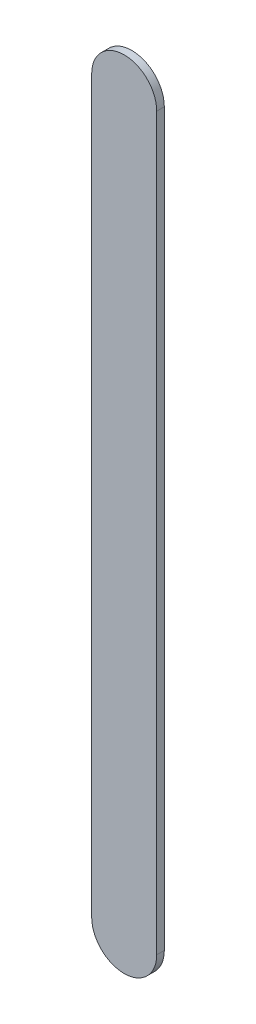
ISO-10303-21;
HEADER;
FILE_DESCRIPTION(('STEP AP214'),'2;1');
FILE_NAME('part.step','',(''),(''),'','','');
FILE_SCHEMA(('AUTOMOTIVE_DESIGN { 1 0 10303 214 1 1 1 1 }'));
ENDSEC;
DATA;
#1=APPLICATION_CONTEXT('core data for automotive mechanical design processes');
#2=APPLICATION_PROTOCOL_DEFINITION('international standard','automotive_design',2000,#1);
#3=PRODUCT_CONTEXT('',#1,'mechanical');
#4=PRODUCT('Part','Part','',(#3));
#5=PRODUCT_RELATED_PRODUCT_CATEGORY('part','',(#4));
#6=PRODUCT_DEFINITION_FORMATION('','',#4);
#7=PRODUCT_DEFINITION_CONTEXT('part definition',#1,'design');
#8=PRODUCT_DEFINITION('design','',#6,#7);
#9=PRODUCT_DEFINITION_SHAPE('','',#8);
#10=(LENGTH_UNIT() NAMED_UNIT(*) SI_UNIT(.MILLI.,.METRE.));
#11=(NAMED_UNIT(*) PLANE_ANGLE_UNIT() SI_UNIT($,.RADIAN.));
#12=(NAMED_UNIT(*) SI_UNIT($,.STERADIAN.) SOLID_ANGLE_UNIT());
#13=UNCERTAINTY_MEASURE_WITH_UNIT(LENGTH_MEASURE(1.E-05),#10,'distance_accuracy_value','');
#14=(GEOMETRIC_REPRESENTATION_CONTEXT(3) GLOBAL_UNCERTAINTY_ASSIGNED_CONTEXT((#13)) GLOBAL_UNIT_ASSIGNED_CONTEXT((#10,
#11,#12)) REPRESENTATION_CONTEXT('',''));
#15=CARTESIAN_POINT('',(0.,0.,0.));
#16=DIRECTION('',(0.,0.,1.));
#17=DIRECTION('',(1.,0.,0.));
#18=AXIS2_PLACEMENT_3D('',#15,#16,#17);
#19=CARTESIAN_POINT('',(126.36,-72.22,1.635));
#20=DIRECTION('',(0.,0.,1.));
#21=DIRECTION('',(1.,0.,0.));
#22=AXIS2_PLACEMENT_3D('',#19,#20,#21);
#23=PLANE('',#22);
#24=DIRECTION('',(0.,-1.,0.));
#25=VECTOR('',#24,1.);
#26=CARTESIAN_POINT('',(126.36,-72.22,1.635));
#27=LINE('',#26,#25);
#28=CARTESIAN_POINT('',(126.36,-72.22,1.635));
#29=VERTEX_POINT('',#28);
#30=CARTESIAN_POINT('',(126.36,-75.59,1.635));
#31=VERTEX_POINT('',#30);
#32=EDGE_CURVE('E82',#29,#31,#27,.T.);
#33=ORIENTED_EDGE('',*,*,#32,.T.);
#34=CARTESIAN_POINT('',(126.51,-75.59,1.635));
#35=DIRECTION('',(0.,0.,1.));
#36=DIRECTION('',(-1.,0.,0.));
#37=AXIS2_PLACEMENT_3D('',#34,#35,#36);
#38=CIRCLE('',#37,0.15);
#39=CARTESIAN_POINT('',(126.66,-75.59,1.635));
#40=VERTEX_POINT('',#39);
#41=EDGE_CURVE('E107',#31,#40,#38,.T.);
#42=ORIENTED_EDGE('',*,*,#41,.T.);
#43=DIRECTION('',(0.,1.,0.));
#44=VECTOR('',#43,1.);
#45=CARTESIAN_POINT('',(126.66,-75.59,1.635));
#46=LINE('',#45,#44);
#47=CARTESIAN_POINT('',(126.66,-72.22,1.635));
#48=VERTEX_POINT('',#47);
#49=EDGE_CURVE('E75',#40,#48,#46,.T.);
#50=ORIENTED_EDGE('',*,*,#49,.T.);
#51=CARTESIAN_POINT('',(126.51,-72.22,1.635));
#52=DIRECTION('',(0.,0.,1.));
#53=DIRECTION('',(1.,0.,0.));
#54=AXIS2_PLACEMENT_3D('',#51,#52,#53);
#55=CIRCLE('',#54,0.15);
#56=EDGE_CURVE('E11',#48,#29,#55,.T.);
#57=ORIENTED_EDGE('',*,*,#56,.T.);
#58=EDGE_LOOP('',(#33,#42,#50,#57));
#59=FACE_BOUND('',#58,.T.);
#60=ADVANCED_FACE('F17',(#59),#23,.T.);
#61=CARTESIAN_POINT('',(126.36,-72.22,1.6));
#62=DIRECTION('',(0.,0.,1.));
#63=DIRECTION('',(1.,0.,0.));
#64=AXIS2_PLACEMENT_3D('',#61,#62,#63);
#65=PLANE('',#64);
#66=CARTESIAN_POINT('',(126.51,-72.22,1.6));
#67=DIRECTION('',(0.,0.,1.));
#68=DIRECTION('',(1.,0.,0.));
#69=AXIS2_PLACEMENT_3D('',#66,#67,#68);
#70=CIRCLE('',#69,0.15);
#71=CARTESIAN_POINT('',(126.66,-72.22,1.6));
#72=VERTEX_POINT('',#71);
#73=CARTESIAN_POINT('',(126.36,-72.22,1.6));
#74=VERTEX_POINT('',#73);
#75=EDGE_CURVE('E21',#72,#74,#70,.T.);
#76=ORIENTED_EDGE('',*,*,#75,.F.);
#77=DIRECTION('',(0.,1.,0.));
#78=VECTOR('',#77,1.);
#79=CARTESIAN_POINT('',(126.66,-75.59,1.6));
#80=LINE('',#79,#78);
#81=CARTESIAN_POINT('',(126.66,-75.59,1.6));
#82=VERTEX_POINT('',#81);
#83=EDGE_CURVE('E98',#82,#72,#80,.T.);
#84=ORIENTED_EDGE('',*,*,#83,.F.);
#85=CARTESIAN_POINT('',(126.51,-75.59,1.6));
#86=DIRECTION('',(0.,0.,1.));
#87=DIRECTION('',(-1.,0.,0.));
#88=AXIS2_PLACEMENT_3D('',#85,#86,#87);
#89=CIRCLE('',#88,0.15);
#90=CARTESIAN_POINT('',(126.36,-75.59,1.6));
#91=VERTEX_POINT('',#90);
#92=EDGE_CURVE('E84',#91,#82,#89,.T.);
#93=ORIENTED_EDGE('',*,*,#92,.F.);
#94=DIRECTION('',(0.,-1.,0.));
#95=VECTOR('',#94,1.);
#96=CARTESIAN_POINT('',(126.36,-72.22,1.6));
#97=LINE('',#96,#95);
#98=EDGE_CURVE('E80',#74,#91,#97,.T.);
#99=ORIENTED_EDGE('',*,*,#98,.F.);
#100=EDGE_LOOP('',(#76,#84,#93,#99));
#101=FACE_BOUND('',#100,.T.);
#102=ADVANCED_FACE('F86',(#101),#65,.F.);
#103=CARTESIAN_POINT('',(126.51,-72.22,1.6));
#104=DIRECTION('',(0.,0.,-1.));
#105=DIRECTION('',(1.,0.,0.));
#106=AXIS2_PLACEMENT_3D('',#103,#104,#105);
#107=CYLINDRICAL_SURFACE('',#106,0.15);
#108=ORIENTED_EDGE('',*,*,#75,.T.);
#109=DIRECTION('',(0.,0.,1.));
#110=VECTOR('',#109,1.);
#111=CARTESIAN_POINT('',(126.36,-72.22,1.6));
#112=LINE('',#111,#110);
#113=EDGE_CURVE('E69',#74,#29,#112,.T.);
#114=ORIENTED_EDGE('',*,*,#113,.T.);
#115=ORIENTED_EDGE('',*,*,#56,.F.);
#116=DIRECTION('',(0.,0.,1.));
#117=VECTOR('',#116,1.);
#118=CARTESIAN_POINT('',(126.66,-72.22,1.6));
#119=LINE('',#118,#117);
#120=EDGE_CURVE('E72',#72,#48,#119,.T.);
#121=ORIENTED_EDGE('',*,*,#120,.F.);
#122=EDGE_LOOP('',(#108,#114,#115,#121));
#123=FACE_BOUND('',#122,.T.);
#124=ADVANCED_FACE('F19',(#123),#107,.T.);
#125=CARTESIAN_POINT('',(126.66,-75.59,1.6));
#126=DIRECTION('',(-1.,0.,0.));
#127=DIRECTION('',(0.,0.,1.));
#128=AXIS2_PLACEMENT_3D('',#125,#126,#127);
#129=PLANE('',#128);
#130=ORIENTED_EDGE('',*,*,#83,.T.);
#131=ORIENTED_EDGE('',*,*,#120,.T.);
#132=ORIENTED_EDGE('',*,*,#49,.F.);
#133=DIRECTION('',(0.,0.,1.));
#134=VECTOR('',#133,1.);
#135=CARTESIAN_POINT('',(126.66,-75.59,1.6));
#136=LINE('',#135,#134);
#137=EDGE_CURVE('E104',#82,#40,#136,.T.);
#138=ORIENTED_EDGE('',*,*,#137,.F.);
#139=EDGE_LOOP('',(#130,#131,#132,#138));
#140=FACE_BOUND('',#139,.T.);
#141=ADVANCED_FACE('F121',(#140),#129,.F.);
#142=CARTESIAN_POINT('',(126.51,-75.59,1.6));
#143=DIRECTION('',(0.,0.,-1.));
#144=DIRECTION('',(-1.,0.,0.));
#145=AXIS2_PLACEMENT_3D('',#142,#143,#144);
#146=CYLINDRICAL_SURFACE('',#145,0.15);
#147=ORIENTED_EDGE('',*,*,#92,.T.);
#148=ORIENTED_EDGE('',*,*,#137,.T.);
#149=ORIENTED_EDGE('',*,*,#41,.F.);
#150=DIRECTION('',(0.,0.,1.));
#151=VECTOR('',#150,1.);
#152=CARTESIAN_POINT('',(126.36,-75.59,1.6));
#153=LINE('',#152,#151);
#154=EDGE_CURVE('E90',#91,#31,#153,.T.);
#155=ORIENTED_EDGE('',*,*,#154,.F.);
#156=EDGE_LOOP('',(#147,#148,#149,#155));
#157=FACE_BOUND('',#156,.T.);
#158=ADVANCED_FACE('F123',(#157),#146,.T.);
#159=CARTESIAN_POINT('',(126.36,-72.22,1.6));
#160=DIRECTION('',(1.,0.,0.));
#161=DIRECTION('',(0.,1.,0.));
#162=AXIS2_PLACEMENT_3D('',#159,#160,#161);
#163=PLANE('',#162);
#164=ORIENTED_EDGE('',*,*,#98,.T.);
#165=ORIENTED_EDGE('',*,*,#154,.T.);
#166=ORIENTED_EDGE('',*,*,#32,.F.);
#167=ORIENTED_EDGE('',*,*,#113,.F.);
#168=EDGE_LOOP('',(#164,#165,#166,#167));
#169=FACE_BOUND('',#168,.T.);
#170=ADVANCED_FACE('F78',(#169),#163,.F.);
#171=CLOSED_SHELL('',(#60,#102,#124,#141,#158,#170));
#172=MANIFOLD_SOLID_BREP('B1',#171);
#173=ADVANCED_BREP_SHAPE_REPRESENTATION('',(#18,#172),#14);
#174=SHAPE_DEFINITION_REPRESENTATION(#9,#173);
ENDSEC;
END-ISO-10303-21;
